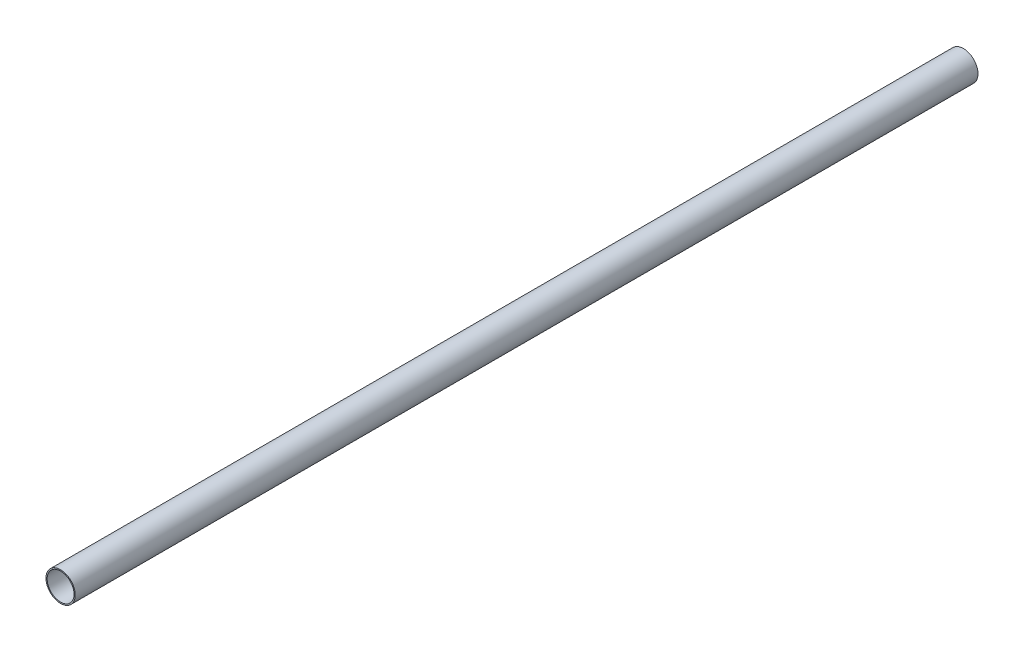
ISO-10303-21;
HEADER;
FILE_DESCRIPTION(('STEP AP214'),'2;1');
FILE_NAME('part.step','',(''),(''),'','','');
FILE_SCHEMA(('AUTOMOTIVE_DESIGN { 1 0 10303 214 1 1 1 1 }'));
ENDSEC;
DATA;
#1=APPLICATION_CONTEXT('core data for automotive mechanical design processes');
#2=APPLICATION_PROTOCOL_DEFINITION('international standard','automotive_design',2000,#1);
#3=PRODUCT_CONTEXT('',#1,'mechanical');
#4=PRODUCT('Part','Part','',(#3));
#5=PRODUCT_RELATED_PRODUCT_CATEGORY('part','',(#4));
#6=PRODUCT_DEFINITION_FORMATION('','',#4);
#7=PRODUCT_DEFINITION_CONTEXT('part definition',#1,'design');
#8=PRODUCT_DEFINITION('design','',#6,#7);
#9=PRODUCT_DEFINITION_SHAPE('','',#8);
#10=(LENGTH_UNIT() NAMED_UNIT(*) SI_UNIT(.MILLI.,.METRE.));
#11=(NAMED_UNIT(*) PLANE_ANGLE_UNIT() SI_UNIT($,.RADIAN.));
#12=(NAMED_UNIT(*) SI_UNIT($,.STERADIAN.) SOLID_ANGLE_UNIT());
#13=UNCERTAINTY_MEASURE_WITH_UNIT(LENGTH_MEASURE(1.E-05),#10,'distance_accuracy_value','');
#14=(GEOMETRIC_REPRESENTATION_CONTEXT(3) GLOBAL_UNCERTAINTY_ASSIGNED_CONTEXT((#13)) GLOBAL_UNIT_ASSIGNED_CONTEXT((#10,
#11,#12)) REPRESENTATION_CONTEXT('',''));
#15=CARTESIAN_POINT('',(0.,0.,0.));
#16=DIRECTION('',(0.,0.,1.));
#17=DIRECTION('',(1.,0.,0.));
#18=AXIS2_PLACEMENT_3D('',#15,#16,#17);
#19=CARTESIAN_POINT('',(0.,0.,685.8));
#20=DIRECTION('',(0.,0.,1.));
#21=DIRECTION('',(1.,0.,0.));
#22=AXIS2_PLACEMENT_3D('',#19,#20,#21);
#23=PLANE('',#22);
#24=CARTESIAN_POINT('',(0.,0.,685.8));
#25=DIRECTION('',(0.,0.,1.));
#26=DIRECTION('',(1.,0.,0.));
#27=AXIS2_PLACEMENT_3D('',#24,#25,#26);
#28=CIRCLE('',#27,11.1125);
#29=CARTESIAN_POINT('',(11.1125,0.,685.8));
#30=VERTEX_POINT('',#29);
#31=EDGE_CURVE('E10',#30,#30,#28,.T.);
#32=ORIENTED_EDGE('',*,*,#31,.T.);
#33=EDGE_LOOP('',(#32));
#34=FACE_BOUND('',#33,.T.);
#35=CARTESIAN_POINT('',(0.,0.,685.8));
#36=DIRECTION('',(0.,0.,1.));
#37=DIRECTION('',(1.,0.,0.));
#38=AXIS2_PLACEMENT_3D('',#35,#36,#37);
#39=CIRCLE('',#38,10.2235);
#40=CARTESIAN_POINT('',(10.2235,0.,685.8));
#41=VERTEX_POINT('',#40);
#42=EDGE_CURVE('E42',#41,#41,#39,.T.);
#43=ORIENTED_EDGE('',*,*,#42,.F.);
#44=EDGE_LOOP('',(#43));
#45=FACE_BOUND('',#44,.T.);
#46=ADVANCED_FACE('F31',(#34,#45),#23,.T.);
#47=CARTESIAN_POINT('',(0.,0.,0.));
#48=DIRECTION('',(0.,0.,1.));
#49=DIRECTION('',(1.,0.,0.));
#50=AXIS2_PLACEMENT_3D('',#47,#48,#49);
#51=PLANE('',#50);
#52=CARTESIAN_POINT('',(0.,0.,0.));
#53=DIRECTION('',(0.,0.,1.));
#54=DIRECTION('',(1.,0.,0.));
#55=AXIS2_PLACEMENT_3D('',#52,#53,#54);
#56=CIRCLE('',#55,11.1125);
#57=CARTESIAN_POINT('',(11.1125,0.,0.));
#58=VERTEX_POINT('',#57);
#59=EDGE_CURVE('E35',#58,#58,#56,.T.);
#60=ORIENTED_EDGE('',*,*,#59,.F.);
#61=EDGE_LOOP('',(#60));
#62=FACE_BOUND('',#61,.T.);
#63=CARTESIAN_POINT('',(0.,0.,0.));
#64=DIRECTION('',(0.,0.,1.));
#65=DIRECTION('',(1.,0.,0.));
#66=AXIS2_PLACEMENT_3D('',#63,#64,#65);
#67=CIRCLE('',#66,10.2235);
#68=CARTESIAN_POINT('',(10.2235,0.,0.));
#69=VERTEX_POINT('',#68);
#70=EDGE_CURVE('E44',#69,#69,#67,.T.);
#71=ORIENTED_EDGE('',*,*,#70,.T.);
#72=EDGE_LOOP('',(#71));
#73=FACE_BOUND('',#72,.T.);
#74=ADVANCED_FACE('F54',(#62,#73),#51,.F.);
#75=CARTESIAN_POINT('',(0.,0.,685.8));
#76=DIRECTION('',(0.,0.,-1.));
#77=DIRECTION('',(-1.,0.,0.));
#78=AXIS2_PLACEMENT_3D('',#75,#76,#77);
#79=CYLINDRICAL_SURFACE('',#78,11.1125);
#80=ORIENTED_EDGE('',*,*,#31,.F.);
#81=EDGE_LOOP('',(#80));
#82=FACE_BOUND('',#81,.T.);
#83=ORIENTED_EDGE('',*,*,#59,.T.);
#84=EDGE_LOOP('',(#83));
#85=FACE_BOUND('',#84,.T.);
#86=ADVANCED_FACE('F33',(#82,#85),#79,.T.);
#87=CARTESIAN_POINT('',(0.,0.,685.8));
#88=DIRECTION('',(0.,0.,-1.));
#89=DIRECTION('',(-1.,0.,0.));
#90=AXIS2_PLACEMENT_3D('',#87,#88,#89);
#91=CYLINDRICAL_SURFACE('',#90,10.2235);
#92=ORIENTED_EDGE('',*,*,#42,.T.);
#93=EDGE_LOOP('',(#92));
#94=FACE_BOUND('',#93,.T.);
#95=ORIENTED_EDGE('',*,*,#70,.F.);
#96=EDGE_LOOP('',(#95));
#97=FACE_BOUND('',#96,.T.);
#98=ADVANCED_FACE('F50',(#94,#97),#91,.F.);
#99=CLOSED_SHELL('',(#46,#74,#86,#98));
#100=MANIFOLD_SOLID_BREP('B2',#99);
#101=ADVANCED_BREP_SHAPE_REPRESENTATION('',(#18,#100),#14);
#102=SHAPE_DEFINITION_REPRESENTATION(#9,#101);
ENDSEC;
END-ISO-10303-21;
